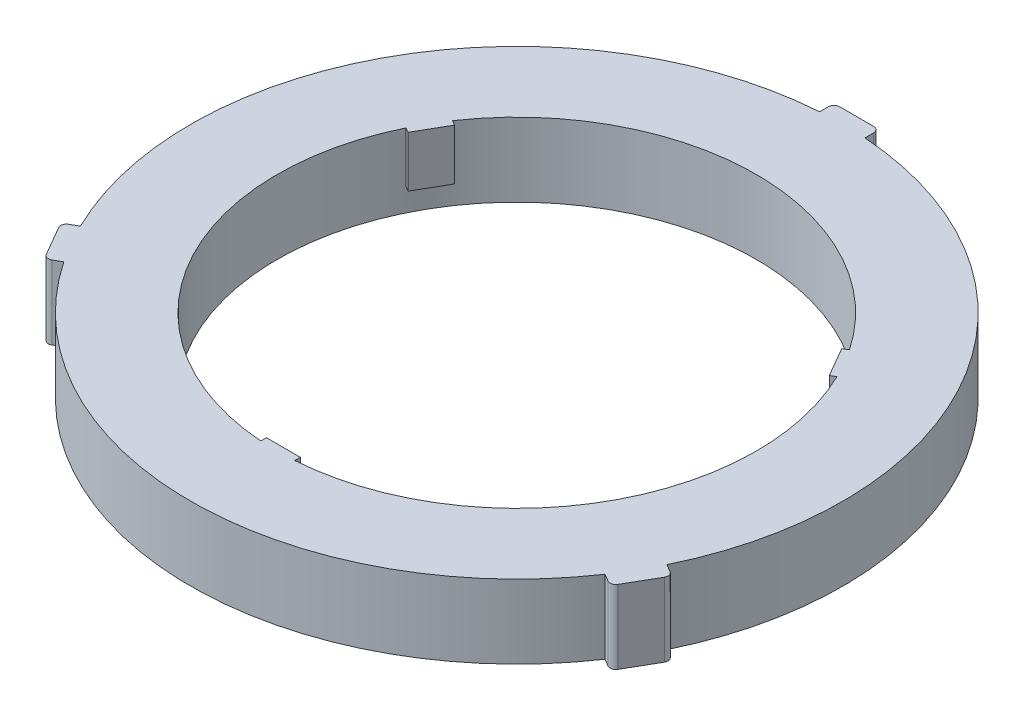
ISO-10303-21;
HEADER;
FILE_DESCRIPTION(('STEP AP214'),'2;1');
FILE_NAME('part.step','',(''),(''),'','','');
FILE_SCHEMA(('AUTOMOTIVE_DESIGN { 1 0 10303 214 1 1 1 1 }'));
ENDSEC;
DATA;
#1=APPLICATION_CONTEXT('core data for automotive mechanical design processes');
#2=APPLICATION_PROTOCOL_DEFINITION('international standard','automotive_design',2000,#1);
#3=PRODUCT_CONTEXT('',#1,'mechanical');
#4=PRODUCT('Part','Part','',(#3));
#5=PRODUCT_RELATED_PRODUCT_CATEGORY('part','',(#4));
#6=PRODUCT_DEFINITION_FORMATION('','',#4);
#7=PRODUCT_DEFINITION_CONTEXT('part definition',#1,'design');
#8=PRODUCT_DEFINITION('design','',#6,#7);
#9=PRODUCT_DEFINITION_SHAPE('','',#8);
#10=(LENGTH_UNIT() NAMED_UNIT(*) SI_UNIT(.MILLI.,.METRE.));
#11=(NAMED_UNIT(*) PLANE_ANGLE_UNIT() SI_UNIT($,.RADIAN.));
#12=(NAMED_UNIT(*) SI_UNIT($,.STERADIAN.) SOLID_ANGLE_UNIT());
#13=UNCERTAINTY_MEASURE_WITH_UNIT(LENGTH_MEASURE(1.E-05),#10,'distance_accuracy_value','');
#14=(GEOMETRIC_REPRESENTATION_CONTEXT(3) GLOBAL_UNCERTAINTY_ASSIGNED_CONTEXT((#13)) GLOBAL_UNIT_ASSIGNED_CONTEXT((#10,
#11,#12)) REPRESENTATION_CONTEXT('',''));
#15=CARTESIAN_POINT('',(0.,0.,0.));
#16=DIRECTION('',(0.,0.,1.));
#17=DIRECTION('',(1.,0.,0.));
#18=AXIS2_PLACEMENT_3D('',#15,#16,#17);
#19=CARTESIAN_POINT('',(0.,0.,0.));
#20=DIRECTION('',(0.,1.,0.));
#21=DIRECTION('',(0.,0.,1.));
#22=AXIS2_PLACEMENT_3D('',#19,#20,#21);
#23=PLANE('',#22);
#24=DIRECTION('',(0.,0.,-1.));
#25=VECTOR('',#24,1.);
#26=CARTESIAN_POINT('',(-1.99999999999999,0.,0.));
#27=LINE('',#26,#25);
#28=CARTESIAN_POINT('',(-2.,0.,-28.7304716285689));
#29=VERTEX_POINT('',#28);
#30=CARTESIAN_POINT('',(-2.,0.,-29.5));
#31=VERTEX_POINT('',#30);
#32=EDGE_CURVE('E580',#29,#31,#27,.T.);
#33=ORIENTED_EDGE('',*,*,#32,.T.);
#34=CARTESIAN_POINT('',(-1.5,0.,-29.5));
#35=DIRECTION('',(0.,1.,0.));
#36=DIRECTION('',(0.,0.,1.));
#37=AXIS2_PLACEMENT_3D('',#34,#35,#36);
#38=CIRCLE('',#37,0.5);
#39=CARTESIAN_POINT('',(-1.5,0.,-30.));
#40=VERTEX_POINT('',#39);
#41=EDGE_CURVE('E311',#31,#40,#38,.F.);
#42=ORIENTED_EDGE('',*,*,#41,.T.);
#43=DIRECTION('',(1.,0.,0.));
#44=VECTOR('',#43,1.);
#45=CARTESIAN_POINT('',(0.,0.,-30.));
#46=LINE('',#45,#44);
#47=CARTESIAN_POINT('',(1.5,0.,-30.));
#48=VERTEX_POINT('',#47);
#49=EDGE_CURVE('E577',#40,#48,#46,.T.);
#50=ORIENTED_EDGE('',*,*,#49,.T.);
#51=CARTESIAN_POINT('',(1.5,0.,-29.5));
#52=DIRECTION('',(0.,1.,0.));
#53=DIRECTION('',(0.,0.,1.));
#54=AXIS2_PLACEMENT_3D('',#51,#52,#53);
#55=CIRCLE('',#54,0.5);
#56=CARTESIAN_POINT('',(2.,0.,-29.5));
#57=VERTEX_POINT('',#56);
#58=EDGE_CURVE('E308',#48,#57,#55,.F.);
#59=ORIENTED_EDGE('',*,*,#58,.T.);
#60=DIRECTION('',(0.,0.,-1.));
#61=VECTOR('',#60,1.);
#62=CARTESIAN_POINT('',(1.99999999999999,0.,0.));
#63=LINE('',#62,#61);
#64=CARTESIAN_POINT('',(2.,0.,-28.7304716285689));
#65=VERTEX_POINT('',#64);
#66=EDGE_CURVE('E573',#65,#57,#63,.T.);
#67=ORIENTED_EDGE('',*,*,#66,.F.);
#68=CARTESIAN_POINT('',(0.,0.,0.));
#69=DIRECTION('',(0.,1.,0.));
#70=DIRECTION('',(0.,0.,1.));
#71=AXIS2_PLACEMENT_3D('',#68,#69,#70);
#72=CIRCLE('',#71,28.8);
#73=CARTESIAN_POINT('',(25.8813182930489,0.,12.6331850067151));
#74=VERTEX_POINT('',#73);
#75=EDGE_CURVE('E561',#74,#65,#72,.T.);
#76=ORIENTED_EDGE('',*,*,#75,.F.);
#77=DIRECTION('',(0.866025403784439,0.,0.5));
#78=VECTOR('',#77,1.);
#79=CARTESIAN_POINT('',(1.00000000000024,0.,-1.73205080756928));
#80=LINE('',#79,#78);
#81=CARTESIAN_POINT('',(26.5477494116414,0.,13.0179491924308));
#82=VERTEX_POINT('',#81);
#83=EDGE_CURVE('E569',#74,#82,#80,.T.);
#84=ORIENTED_EDGE('',*,*,#83,.T.);
#85=CARTESIAN_POINT('',(26.2977494116414,0.,13.450961894323));
#86=DIRECTION('',(0.,1.,0.));
#87=DIRECTION('',(0.,0.,1.));
#88=AXIS2_PLACEMENT_3D('',#85,#86,#87);
#89=CIRCLE('',#88,0.5);
#90=CARTESIAN_POINT('',(26.7307621135336,0.,13.700961894323));
#91=VERTEX_POINT('',#90);
#92=EDGE_CURVE('E305',#82,#91,#89,.F.);
#93=ORIENTED_EDGE('',*,*,#92,.T.);
#94=DIRECTION('',(-0.5,0.,0.866025403784439));
#95=VECTOR('',#94,1.);
#96=CARTESIAN_POINT('',(25.9807621135334,0.,15.0000000000001));
#97=LINE('',#96,#95);
#98=CARTESIAN_POINT('',(25.2307621135336,0.,16.2990381056764));
#99=VERTEX_POINT('',#98);
#100=EDGE_CURVE('E565',#91,#99,#97,.T.);
#101=ORIENTED_EDGE('',*,*,#100,.T.);
#102=CARTESIAN_POINT('',(24.7977494116414,0.,16.0490381056764));
#103=DIRECTION('',(0.,1.,0.));
#104=DIRECTION('',(0.,0.,1.));
#105=AXIS2_PLACEMENT_3D('',#102,#103,#104);
#106=CIRCLE('',#105,0.5);
#107=CARTESIAN_POINT('',(24.5477494116414,0.,16.4820508075686));
#108=VERTEX_POINT('',#107);
#109=EDGE_CURVE('E302',#99,#108,#106,.F.);
#110=ORIENTED_EDGE('',*,*,#109,.T.);
#111=DIRECTION('',(0.866025403784439,0.,0.5));
#112=VECTOR('',#111,1.);
#113=CARTESIAN_POINT('',(-0.999999999999765,0.,1.73205080756847));
#114=LINE('',#113,#112);
#115=CARTESIAN_POINT('',(23.881318293049,0.,16.0972866218529));
#116=VERTEX_POINT('',#115);
#117=EDGE_CURVE('E560',#116,#108,#114,.T.);
#118=ORIENTED_EDGE('',*,*,#117,.F.);
#119=CARTESIAN_POINT('',(-23.8813182930485,0.,16.0972866218537));
#120=VERTEX_POINT('',#119);
#121=EDGE_CURVE('E555',#120,#116,#72,.T.);
#122=ORIENTED_EDGE('',*,*,#121,.F.);
#123=DIRECTION('',(-0.866025403784437,0.,0.500000000000003));
#124=VECTOR('',#123,1.);
#125=CARTESIAN_POINT('',(1.00000000000018,0.,1.73205080756917));
#126=LINE('',#125,#124);
#127=CARTESIAN_POINT('',(-24.5477494116405,0.,16.4820508075691));
#128=VERTEX_POINT('',#127);
#129=EDGE_CURVE('E393',#120,#128,#126,.T.);
#130=ORIENTED_EDGE('',*,*,#129,.T.);
#131=CARTESIAN_POINT('',(-24.7977494116405,0.,16.0490381056769));
#132=DIRECTION('',(0.,1.,0.));
#133=DIRECTION('',(0.,0.,1.));
#134=AXIS2_PLACEMENT_3D('',#131,#132,#133);
#135=CIRCLE('',#134,0.5);
#136=CARTESIAN_POINT('',(-25.2307621135327,0.,16.2990381056769));
#137=VERTEX_POINT('',#136);
#138=EDGE_CURVE('E295',#128,#137,#135,.F.);
#139=ORIENTED_EDGE('',*,*,#138,.T.);
#140=DIRECTION('',(-0.500000000000001,0.,-0.866025403784438));
#141=VECTOR('',#140,1.);
#142=CARTESIAN_POINT('',(-25.9807621135329,0.,14.9999999999999));
#143=LINE('',#142,#141);
#144=CARTESIAN_POINT('',(-26.7307621135327,0.,13.7009618943236));
#145=VERTEX_POINT('',#144);
#146=EDGE_CURVE('E386',#137,#145,#143,.T.);
#147=ORIENTED_EDGE('',*,*,#146,.T.);
#148=CARTESIAN_POINT('',(-26.2977494116405,0.,13.4509618943236));
#149=DIRECTION('',(0.,1.,0.));
#150=DIRECTION('',(0.,0.,1.));
#151=AXIS2_PLACEMENT_3D('',#148,#149,#150);
#152=CIRCLE('',#151,0.5);
#153=CARTESIAN_POINT('',(-26.5477494116405,0.,13.0179491924314));
#154=VERTEX_POINT('',#153);
#155=EDGE_CURVE('E299',#145,#154,#152,.F.);
#156=ORIENTED_EDGE('',*,*,#155,.T.);
#157=DIRECTION('',(-0.86602540378444,0.,0.499999999999999));
#158=VECTOR('',#157,1.);
#159=CARTESIAN_POINT('',(-0.999999999999759,0.,-1.73205080756847));
#160=LINE('',#159,#158);
#161=CARTESIAN_POINT('',(-25.8813182930485,0.,12.6331850067159));
#162=VERTEX_POINT('',#161);
#163=EDGE_CURVE('E369',#162,#154,#160,.T.);
#164=ORIENTED_EDGE('',*,*,#163,.F.);
#165=EDGE_CURVE('E399',#29,#162,#72,.T.);
#166=ORIENTED_EDGE('',*,*,#165,.F.);
#167=EDGE_LOOP('',(#33,#42,#50,#59,#67,#76,#84,#93,#101,#110,#118,#122,#130,#139,#147,#156,#164,#166));
#168=FACE_BOUND('',#167,.T.);
#169=CARTESIAN_POINT('',(0.,0.,0.));
#170=DIRECTION('',(0.,1.,0.));
#171=DIRECTION('',(0.,0.,1.));
#172=AXIS2_PLACEMENT_3D('',#169,#170,#171);
#173=CIRCLE('',#172,21.15);
#174=CARTESIAN_POINT('',(0.,0.,21.15));
#175=VERTEX_POINT('',#174);
#176=EDGE_CURVE('E551',#175,#175,#173,.T.);
#177=ORIENTED_EDGE('',*,*,#176,.T.);
#178=EDGE_LOOP('',(#177));
#179=FACE_BOUND('',#178,.T.);
#180=ADVANCED_FACE('F47',(#168,#179),#23,.F.);
#181=CARTESIAN_POINT('',(0.,6.5,0.));
#182=DIRECTION('',(0.,-1.,0.));
#183=DIRECTION('',(0.,0.,-1.));
#184=AXIS2_PLACEMENT_3D('',#181,#182,#183);
#185=CYLINDRICAL_SURFACE('',#184,28.8);
#186=ORIENTED_EDGE('',*,*,#121,.T.);
#187=DIRECTION('',(0.,-1.,0.));
#188=VECTOR('',#187,1.);
#189=CARTESIAN_POINT('',(23.881318293049,6.5,16.0972866218529));
#190=LINE('',#189,#188);
#191=CARTESIAN_POINT('',(23.881318293049,6.5,16.0972866218529));
#192=VERTEX_POINT('',#191);
#193=EDGE_CURVE('E296',#192,#116,#190,.T.);
#194=ORIENTED_EDGE('',*,*,#193,.F.);
#195=CARTESIAN_POINT('',(0.,6.5,0.));
#196=DIRECTION('',(0.,1.,0.));
#197=DIRECTION('',(0.,0.,1.));
#198=AXIS2_PLACEMENT_3D('',#195,#196,#197);
#199=CIRCLE('',#198,28.8);
#200=CARTESIAN_POINT('',(-23.8813182930485,6.5,16.0972866218537));
#201=VERTEX_POINT('',#200);
#202=EDGE_CURVE('E518',#201,#192,#199,.T.);
#203=ORIENTED_EDGE('',*,*,#202,.F.);
#204=DIRECTION('',(0.,-1.,0.));
#205=VECTOR('',#204,1.);
#206=CARTESIAN_POINT('',(-23.8813182930485,6.5,16.0972866218537));
#207=LINE('',#206,#205);
#208=EDGE_CURVE('E290',#201,#120,#207,.T.);
#209=ORIENTED_EDGE('',*,*,#208,.T.);
#210=EDGE_LOOP('',(#186,#194,#203,#209));
#211=FACE_BOUND('',#210,.T.);
#212=ADVANCED_FACE('F638',(#211),#185,.T.);
#213=CARTESIAN_POINT('',(-0.999999999999765,6.5,1.73205080756847));
#214=DIRECTION('',(0.5,0.,-0.866025403784439));
#215=DIRECTION('',(-0.866025403784439,0.,-0.5));
#216=AXIS2_PLACEMENT_3D('',#213,#214,#215);
#217=PLANE('',#216);
#218=ORIENTED_EDGE('',*,*,#117,.T.);
#219=DIRECTION('',(0.,-1.,0.));
#220=VECTOR('',#219,1.);
#221=CARTESIAN_POINT('',(24.5477494116414,6.5,16.4820508075686));
#222=LINE('',#221,#220);
#223=CARTESIAN_POINT('',(24.5477494116414,6.5,16.4820508075686));
#224=VERTEX_POINT('',#223);
#225=EDGE_CURVE('E351',#108,#224,#222,.F.);
#226=ORIENTED_EDGE('',*,*,#225,.T.);
#227=DIRECTION('',(0.866025403784439,0.,0.5));
#228=VECTOR('',#227,1.);
#229=CARTESIAN_POINT('',(-0.999999999999765,6.5,1.73205080756847));
#230=LINE('',#229,#228);
#231=EDGE_CURVE('E522',#192,#224,#230,.T.);
#232=ORIENTED_EDGE('',*,*,#231,.F.);
#233=ORIENTED_EDGE('',*,*,#193,.T.);
#234=EDGE_LOOP('',(#218,#226,#232,#233));
#235=FACE_BOUND('',#234,.T.);
#236=ADVANCED_FACE('F634',(#235),#217,.F.);
#237=CARTESIAN_POINT('',(25.9807621135334,6.5,15.0000000000001));
#238=DIRECTION('',(0.866025403784439,0.,0.5));
#239=DIRECTION('',(0.5,0.,-0.866025403784439));
#240=AXIS2_PLACEMENT_3D('',#237,#238,#239);
#241=PLANE('',#240);
#242=ORIENTED_EDGE('',*,*,#100,.F.);
#243=DIRECTION('',(0.,-1.,0.));
#244=VECTOR('',#243,1.);
#245=CARTESIAN_POINT('',(26.7307621135336,6.5,13.700961894323));
#246=LINE('',#245,#244);
#247=CARTESIAN_POINT('',(26.7307621135336,6.5,13.700961894323));
#248=VERTEX_POINT('',#247);
#249=EDGE_CURVE('E348',#91,#248,#246,.F.);
#250=ORIENTED_EDGE('',*,*,#249,.T.);
#251=DIRECTION('',(-0.5,0.,0.866025403784439));
#252=VECTOR('',#251,1.);
#253=CARTESIAN_POINT('',(25.9807621135334,6.5,15.0000000000001));
#254=LINE('',#253,#252);
#255=CARTESIAN_POINT('',(25.2307621135336,6.5,16.2990381056764));
#256=VERTEX_POINT('',#255);
#257=EDGE_CURVE('E527',#248,#256,#254,.T.);
#258=ORIENTED_EDGE('',*,*,#257,.T.);
#259=DIRECTION('',(0.,-1.,0.));
#260=VECTOR('',#259,1.);
#261=CARTESIAN_POINT('',(25.2307621135336,0.,16.2990381056764));
#262=LINE('',#261,#260);
#263=EDGE_CURVE('E344',#256,#99,#262,.T.);
#264=ORIENTED_EDGE('',*,*,#263,.T.);
#265=EDGE_LOOP('',(#242,#250,#258,#264));
#266=FACE_BOUND('',#265,.T.);
#267=ADVANCED_FACE('F626',(#266),#241,.T.);
#268=CARTESIAN_POINT('',(1.00000000000024,6.5,-1.73205080756928));
#269=DIRECTION('',(0.5,0.,-0.866025403784439));
#270=DIRECTION('',(-0.866025403784439,0.,-0.5));
#271=AXIS2_PLACEMENT_3D('',#268,#269,#270);
#272=PLANE('',#271);
#273=DIRECTION('',(0.866025403784439,0.,0.5));
#274=VECTOR('',#273,1.);
#275=CARTESIAN_POINT('',(1.00000000000024,6.5,-1.73205080756928));
#276=LINE('',#275,#274);
#277=CARTESIAN_POINT('',(25.8813182930489,6.5,12.6331850067151));
#278=VERTEX_POINT('',#277);
#279=CARTESIAN_POINT('',(26.5477494116414,6.5,13.0179491924308));
#280=VERTEX_POINT('',#279);
#281=EDGE_CURVE('E531',#278,#280,#276,.T.);
#282=ORIENTED_EDGE('',*,*,#281,.T.);
#283=DIRECTION('',(0.,-1.,0.));
#284=VECTOR('',#283,1.);
#285=CARTESIAN_POINT('',(26.5477494116414,6.5,13.0179491924308));
#286=LINE('',#285,#284);
#287=EDGE_CURVE('E340',#280,#82,#286,.T.);
#288=ORIENTED_EDGE('',*,*,#287,.T.);
#289=ORIENTED_EDGE('',*,*,#83,.F.);
#290=DIRECTION('',(0.,-1.,0.));
#291=VECTOR('',#290,1.);
#292=CARTESIAN_POINT('',(25.8813182930489,6.5,12.6331850067151));
#293=LINE('',#292,#291);
#294=EDGE_CURVE('E415',#278,#74,#293,.T.);
#295=ORIENTED_EDGE('',*,*,#294,.F.);
#296=EDGE_LOOP('',(#282,#288,#289,#295));
#297=FACE_BOUND('',#296,.T.);
#298=ADVANCED_FACE('F620',(#297),#272,.T.);
#299=ORIENTED_EDGE('',*,*,#75,.T.);
#300=DIRECTION('',(0.,-1.,0.));
#301=VECTOR('',#300,1.);
#302=CARTESIAN_POINT('',(2.,6.5,-28.7304716285689));
#303=LINE('',#302,#301);
#304=CARTESIAN_POINT('',(2.,6.5,-28.7304716285689));
#305=VERTEX_POINT('',#304);
#306=EDGE_CURVE('E411',#305,#65,#303,.T.);
#307=ORIENTED_EDGE('',*,*,#306,.F.);
#308=EDGE_CURVE('E523',#278,#305,#199,.T.);
#309=ORIENTED_EDGE('',*,*,#308,.F.);
#310=ORIENTED_EDGE('',*,*,#294,.T.);
#311=EDGE_LOOP('',(#299,#307,#309,#310));
#312=FACE_BOUND('',#311,.T.);
#313=ADVANCED_FACE('F590',(#312),#185,.T.);
#314=CARTESIAN_POINT('',(1.99999999999999,6.5,0.));
#315=DIRECTION('',(-1.,0.,0.));
#316=DIRECTION('',(0.,0.,1.));
#317=AXIS2_PLACEMENT_3D('',#314,#315,#316);
#318=PLANE('',#317);
#319=ORIENTED_EDGE('',*,*,#66,.T.);
#320=DIRECTION('',(0.,-1.,0.));
#321=VECTOR('',#320,1.);
#322=CARTESIAN_POINT('',(2.,6.5,-29.5));
#323=LINE('',#322,#321);
#324=CARTESIAN_POINT('',(2.,6.5,-29.5));
#325=VERTEX_POINT('',#324);
#326=EDGE_CURVE('E337',#57,#325,#323,.F.);
#327=ORIENTED_EDGE('',*,*,#326,.T.);
#328=DIRECTION('',(0.,0.,-1.));
#329=VECTOR('',#328,1.);
#330=CARTESIAN_POINT('',(1.99999999999999,6.5,0.));
#331=LINE('',#330,#329);
#332=EDGE_CURVE('E535',#305,#325,#331,.T.);
#333=ORIENTED_EDGE('',*,*,#332,.F.);
#334=ORIENTED_EDGE('',*,*,#306,.T.);
#335=EDGE_LOOP('',(#319,#327,#333,#334));
#336=FACE_BOUND('',#335,.T.);
#337=ADVANCED_FACE('F596',(#336),#318,.F.);
#338=CARTESIAN_POINT('',(0.,6.5,-30.));
#339=DIRECTION('',(0.,0.,-1.));
#340=DIRECTION('',(-1.,0.,0.));
#341=AXIS2_PLACEMENT_3D('',#338,#339,#340);
#342=PLANE('',#341);
#343=ORIENTED_EDGE('',*,*,#49,.F.);
#344=DIRECTION('',(0.,-1.,0.));
#345=VECTOR('',#344,1.);
#346=CARTESIAN_POINT('',(-1.5,6.5,-30.));
#347=LINE('',#346,#345);
#348=CARTESIAN_POINT('',(-1.5,6.5,-30.));
#349=VERTEX_POINT('',#348);
#350=EDGE_CURVE('E318',#40,#349,#347,.F.);
#351=ORIENTED_EDGE('',*,*,#350,.T.);
#352=DIRECTION('',(1.,0.,0.));
#353=VECTOR('',#352,1.);
#354=CARTESIAN_POINT('',(0.,6.5,-30.));
#355=LINE('',#354,#353);
#356=CARTESIAN_POINT('',(1.5,6.5,-30.));
#357=VERTEX_POINT('',#356);
#358=EDGE_CURVE('E539',#349,#357,#355,.T.);
#359=ORIENTED_EDGE('',*,*,#358,.T.);
#360=DIRECTION('',(0.,-1.,0.));
#361=VECTOR('',#360,1.);
#362=CARTESIAN_POINT('',(1.5,0.,-30.));
#363=LINE('',#362,#361);
#364=EDGE_CURVE('E314',#357,#48,#363,.T.);
#365=ORIENTED_EDGE('',*,*,#364,.T.);
#366=EDGE_LOOP('',(#343,#351,#359,#365));
#367=FACE_BOUND('',#366,.T.);
#368=ADVANCED_FACE('F604',(#367),#342,.T.);
#369=CARTESIAN_POINT('',(-1.99999999999999,6.5,0.));
#370=DIRECTION('',(-1.,0.,0.));
#371=DIRECTION('',(0.,0.,1.));
#372=AXIS2_PLACEMENT_3D('',#369,#370,#371);
#373=PLANE('',#372);
#374=DIRECTION('',(0.,0.,-1.));
#375=VECTOR('',#374,1.);
#376=CARTESIAN_POINT('',(-1.99999999999999,6.5,0.));
#377=LINE('',#376,#375);
#378=CARTESIAN_POINT('',(-2.,6.5,-28.7304716285689));
#379=VERTEX_POINT('',#378);
#380=CARTESIAN_POINT('',(-2.,6.5,-29.5));
#381=VERTEX_POINT('',#380);
#382=EDGE_CURVE('E543',#379,#381,#377,.T.);
#383=ORIENTED_EDGE('',*,*,#382,.T.);
#384=DIRECTION('',(0.,-1.,0.));
#385=VECTOR('',#384,1.);
#386=CARTESIAN_POINT('',(-2.,6.5,-29.5));
#387=LINE('',#386,#385);
#388=EDGE_CURVE('E291',#381,#31,#387,.T.);
#389=ORIENTED_EDGE('',*,*,#388,.T.);
#390=ORIENTED_EDGE('',*,*,#32,.F.);
#391=DIRECTION('',(0.,-1.,0.));
#392=VECTOR('',#391,1.);
#393=CARTESIAN_POINT('',(-2.,6.5,-28.7304716285689));
#394=LINE('',#393,#392);
#395=EDGE_CURVE('E408',#379,#29,#394,.T.);
#396=ORIENTED_EDGE('',*,*,#395,.F.);
#397=EDGE_LOOP('',(#383,#389,#390,#396));
#398=FACE_BOUND('',#397,.T.);
#399=ADVANCED_FACE('F611',(#398),#373,.T.);
#400=ORIENTED_EDGE('',*,*,#165,.T.);
#401=DIRECTION('',(0.,-1.,0.));
#402=VECTOR('',#401,1.);
#403=CARTESIAN_POINT('',(-25.8813182930485,6.5,12.6331850067159));
#404=LINE('',#403,#402);
#405=CARTESIAN_POINT('',(-25.8813182930485,6.5,12.6331850067159));
#406=VERTEX_POINT('',#405);
#407=EDGE_CURVE('E405',#406,#162,#404,.T.);
#408=ORIENTED_EDGE('',*,*,#407,.F.);
#409=EDGE_CURVE('E375',#379,#406,#199,.T.);
#410=ORIENTED_EDGE('',*,*,#409,.F.);
#411=ORIENTED_EDGE('',*,*,#395,.T.);
#412=EDGE_LOOP('',(#400,#408,#410,#411));
#413=FACE_BOUND('',#412,.T.);
#414=ADVANCED_FACE('F612',(#413),#185,.T.);
#415=CARTESIAN_POINT('',(-0.999999999999759,6.5,-1.73205080756847));
#416=DIRECTION('',(0.499999999999999,0.,0.866025403784439));
#417=DIRECTION('',(0.86602540378444,0.,-0.499999999999999));
#418=AXIS2_PLACEMENT_3D('',#415,#416,#417);
#419=PLANE('',#418);
#420=ORIENTED_EDGE('',*,*,#163,.T.);
#421=DIRECTION('',(0.,-1.,0.));
#422=VECTOR('',#421,1.);
#423=CARTESIAN_POINT('',(-26.5477494116405,6.5,13.0179491924314));
#424=LINE('',#423,#422);
#425=CARTESIAN_POINT('',(-26.5477494116405,6.5,13.0179491924314));
#426=VERTEX_POINT('',#425);
#427=EDGE_CURVE('E56',#154,#426,#424,.F.);
#428=ORIENTED_EDGE('',*,*,#427,.T.);
#429=DIRECTION('',(-0.86602540378444,0.,0.499999999999999));
#430=VECTOR('',#429,1.);
#431=CARTESIAN_POINT('',(-0.999999999999759,6.5,-1.73205080756847));
#432=LINE('',#431,#430);
#433=EDGE_CURVE('E367',#406,#426,#432,.T.);
#434=ORIENTED_EDGE('',*,*,#433,.F.);
#435=ORIENTED_EDGE('',*,*,#407,.T.);
#436=EDGE_LOOP('',(#420,#428,#434,#435));
#437=FACE_BOUND('',#436,.T.);
#438=ADVANCED_FACE('F365',(#437),#419,.F.);
#439=CARTESIAN_POINT('',(-25.9807621135329,6.5,14.9999999999999));
#440=DIRECTION('',(-0.866025403784438,0.,0.500000000000001));
#441=DIRECTION('',(0.500000000000001,0.,0.866025403784438));
#442=AXIS2_PLACEMENT_3D('',#439,#440,#441);
#443=PLANE('',#442);
#444=DIRECTION('',(-0.500000000000001,0.,-0.866025403784438));
#445=VECTOR('',#444,1.);
#446=CARTESIAN_POINT('',(-25.9807621135329,6.5,14.9999999999999));
#447=LINE('',#446,#445);
#448=CARTESIAN_POINT('',(-25.2307621135327,6.5,16.2990381056769));
#449=VERTEX_POINT('',#448);
#450=CARTESIAN_POINT('',(-26.7307621135327,6.5,13.7009618943236));
#451=VERTEX_POINT('',#450);
#452=EDGE_CURVE('E378',#449,#451,#447,.T.);
#453=ORIENTED_EDGE('',*,*,#452,.T.);
#454=DIRECTION('',(0.,-1.,0.));
#455=VECTOR('',#454,1.);
#456=CARTESIAN_POINT('',(-26.7307621135327,0.,13.7009618943236));
#457=LINE('',#456,#455);
#458=EDGE_CURVE('E357',#451,#145,#457,.T.);
#459=ORIENTED_EDGE('',*,*,#458,.T.);
#460=ORIENTED_EDGE('',*,*,#146,.F.);
#461=DIRECTION('',(0.,-1.,0.));
#462=VECTOR('',#461,1.);
#463=CARTESIAN_POINT('',(-25.2307621135327,6.5,16.2990381056769));
#464=LINE('',#463,#462);
#465=EDGE_CURVE('E354',#137,#449,#464,.F.);
#466=ORIENTED_EDGE('',*,*,#465,.T.);
#467=EDGE_LOOP('',(#453,#459,#460,#466));
#468=FACE_BOUND('',#467,.T.);
#469=ADVANCED_FACE('F385',(#468),#443,.T.);
#470=CARTESIAN_POINT('',(1.5,6.5,0.));
#471=DIRECTION('',(-1.,0.,0.));
#472=DIRECTION('',(0.,0.,1.));
#473=AXIS2_PLACEMENT_3D('',#470,#471,#472);
#474=PLANE('',#473);
#475=DIRECTION('',(0.,-1.,0.));
#476=VECTOR('',#475,1.);
#477=CARTESIAN_POINT('',(1.5,6.5,21.096741454547));
#478=LINE('',#477,#476);
#479=CARTESIAN_POINT('',(1.5,6.5,21.096741454547));
#480=VERTEX_POINT('',#479);
#481=CARTESIAN_POINT('',(1.5,2.,21.096741454547));
#482=VERTEX_POINT('',#481);
#483=EDGE_CURVE('E287',#480,#482,#478,.T.);
#484=ORIENTED_EDGE('',*,*,#483,.T.);
#485=DIRECTION('',(0.,0.,-1.));
#486=VECTOR('',#485,1.);
#487=CARTESIAN_POINT('',(1.5,2.,0.));
#488=LINE('',#487,#486);
#489=CARTESIAN_POINT('',(1.5,2.,20.6));
#490=VERTEX_POINT('',#489);
#491=EDGE_CURVE('E252',#482,#490,#488,.T.);
#492=ORIENTED_EDGE('',*,*,#491,.T.);
#493=DIRECTION('',(0.,-1.,0.));
#494=VECTOR('',#493,1.);
#495=CARTESIAN_POINT('',(1.5,6.5,20.6));
#496=LINE('',#495,#494);
#497=CARTESIAN_POINT('',(1.5,6.5,20.6));
#498=VERTEX_POINT('',#497);
#499=EDGE_CURVE('E277',#498,#490,#496,.T.);
#500=ORIENTED_EDGE('',*,*,#499,.F.);
#501=DIRECTION('',(0.,0.,-1.));
#502=VECTOR('',#501,1.);
#503=CARTESIAN_POINT('',(1.5,6.5,0.));
#504=LINE('',#503,#502);
#505=EDGE_CURVE('E488',#480,#498,#504,.T.);
#506=ORIENTED_EDGE('',*,*,#505,.F.);
#507=EDGE_LOOP('',(#484,#492,#500,#506));
#508=FACE_BOUND('',#507,.T.);
#509=ADVANCED_FACE('F667',(#508),#474,.F.);
#510=CARTESIAN_POINT('',(0.,6.5,20.6));
#511=DIRECTION('',(0.,0.,-1.));
#512=DIRECTION('',(-1.,0.,0.));
#513=AXIS2_PLACEMENT_3D('',#510,#511,#512);
#514=PLANE('',#513);
#515=DIRECTION('',(1.,0.,0.));
#516=VECTOR('',#515,1.);
#517=CARTESIAN_POINT('',(0.,2.,20.6));
#518=LINE('',#517,#516);
#519=CARTESIAN_POINT('',(-1.5,2.,20.6));
#520=VERTEX_POINT('',#519);
#521=EDGE_CURVE('E556',#520,#490,#518,.T.);
#522=ORIENTED_EDGE('',*,*,#521,.F.);
#523=DIRECTION('',(0.,-1.,0.));
#524=VECTOR('',#523,1.);
#525=CARTESIAN_POINT('',(-1.5,6.5,20.6));
#526=LINE('',#525,#524);
#527=CARTESIAN_POINT('',(-1.5,6.5,20.6));
#528=VERTEX_POINT('',#527);
#529=EDGE_CURVE('E264',#528,#520,#526,.T.);
#530=ORIENTED_EDGE('',*,*,#529,.F.);
#531=DIRECTION('',(1.,0.,0.));
#532=VECTOR('',#531,1.);
#533=CARTESIAN_POINT('',(0.,6.5,20.6));
#534=LINE('',#533,#532);
#535=EDGE_CURVE('E492',#528,#498,#534,.T.);
#536=ORIENTED_EDGE('',*,*,#535,.T.);
#537=ORIENTED_EDGE('',*,*,#499,.T.);
#538=EDGE_LOOP('',(#522,#530,#536,#537));
#539=FACE_BOUND('',#538,.T.);
#540=ADVANCED_FACE('F707',(#539),#514,.T.);
#541=CARTESIAN_POINT('',(-1.5,6.5,0.));
#542=DIRECTION('',(-1.,0.,0.));
#543=DIRECTION('',(0.,0.,1.));
#544=AXIS2_PLACEMENT_3D('',#541,#542,#543);
#545=PLANE('',#544);
#546=DIRECTION('',(0.,0.,-1.));
#547=VECTOR('',#546,1.);
#548=CARTESIAN_POINT('',(-1.5,2.,0.));
#549=LINE('',#548,#547);
#550=CARTESIAN_POINT('',(-1.5,2.,21.096741454547));
#551=VERTEX_POINT('',#550);
#552=EDGE_CURVE('E249',#551,#520,#549,.T.);
#553=ORIENTED_EDGE('',*,*,#552,.F.);
#554=DIRECTION('',(0.,-1.,0.));
#555=VECTOR('',#554,1.);
#556=CARTESIAN_POINT('',(-1.5,6.5,21.096741454547));
#557=LINE('',#556,#555);
#558=CARTESIAN_POINT('',(-1.5,6.5,21.096741454547));
#559=VERTEX_POINT('',#558);
#560=EDGE_CURVE('E262',#559,#551,#557,.T.);
#561=ORIENTED_EDGE('',*,*,#560,.F.);
#562=DIRECTION('',(0.,0.,-1.));
#563=VECTOR('',#562,1.);
#564=CARTESIAN_POINT('',(-1.5,6.5,0.));
#565=LINE('',#564,#563);
#566=EDGE_CURVE('E496',#559,#528,#565,.T.);
#567=ORIENTED_EDGE('',*,*,#566,.T.);
#568=ORIENTED_EDGE('',*,*,#529,.T.);
#569=EDGE_LOOP('',(#553,#561,#567,#568));
#570=FACE_BOUND('',#569,.T.);
#571=ADVANCED_FACE('F260',(#570),#545,.T.);
#572=CARTESIAN_POINT('',(-0.749999999999994,6.5,1.29903810567665));
#573=DIRECTION('',(0.499999999999999,0.,-0.866025403784439));
#574=DIRECTION('',(-0.866025403784439,0.,-0.499999999999999));
#575=AXIS2_PLACEMENT_3D('',#572,#573,#574);
#576=PLANE('',#575);
#577=DIRECTION('',(0.,-1.,0.));
#578=VECTOR('',#577,1.);
#579=CARTESIAN_POINT('',(-19.0203140367099,6.5,-9.24933262159682));
#580=LINE('',#579,#578);
#581=CARTESIAN_POINT('',(-19.0203140367099,6.5,-9.24933262159682));
#582=VERTEX_POINT('',#581);
#583=CARTESIAN_POINT('',(-19.0203140367099,2.,-9.24933262159682));
#584=VERTEX_POINT('',#583);
#585=EDGE_CURVE('E273',#582,#584,#580,.T.);
#586=ORIENTED_EDGE('',*,*,#585,.T.);
#587=DIRECTION('',(0.866025403784439,0.,0.499999999999999));
#588=VECTOR('',#587,1.);
#589=CARTESIAN_POINT('',(-0.749999999999994,2.,1.29903810567665));
#590=LINE('',#589,#588);
#591=CARTESIAN_POINT('',(-18.5901233179594,2.,-9.00096189432334));
#592=VERTEX_POINT('',#591);
#593=EDGE_CURVE('E460',#584,#592,#590,.T.);
#594=ORIENTED_EDGE('',*,*,#593,.T.);
#595=DIRECTION('',(0.,-1.,0.));
#596=VECTOR('',#595,1.);
#597=CARTESIAN_POINT('',(-18.5901233179594,6.5,-9.00096189432334));
#598=LINE('',#597,#596);
#599=CARTESIAN_POINT('',(-18.5901233179594,6.5,-9.00096189432334));
#600=VERTEX_POINT('',#599);
#601=EDGE_CURVE('E280',#600,#592,#598,.T.);
#602=ORIENTED_EDGE('',*,*,#601,.F.);
#603=DIRECTION('',(0.866025403784439,0.,0.499999999999999));
#604=VECTOR('',#603,1.);
#605=CARTESIAN_POINT('',(-0.749999999999994,6.5,1.29903810567665));
#606=LINE('',#605,#604);
#607=EDGE_CURVE('E458',#582,#600,#606,.T.);
#608=ORIENTED_EDGE('',*,*,#607,.F.);
#609=EDGE_LOOP('',(#586,#594,#602,#608));
#610=FACE_BOUND('',#609,.T.);
#611=ADVANCED_FACE('F457',(#610),#576,.F.);
#612=CARTESIAN_POINT('',(-17.8401233179594,6.5,-10.3));
#613=DIRECTION('',(0.866025403784438,0.,0.5));
#614=DIRECTION('',(0.5,0.,-0.866025403784439));
#615=AXIS2_PLACEMENT_3D('',#612,#613,#614);
#616=PLANE('',#615);
#617=DIRECTION('',(-0.5,0.,0.866025403784439));
#618=VECTOR('',#617,1.);
#619=CARTESIAN_POINT('',(-17.8401233179594,2.,-10.3));
#620=LINE('',#619,#618);
#621=CARTESIAN_POINT('',(-17.0901233179594,2.,-11.5990381056766));
#622=VERTEX_POINT('',#621);
#623=EDGE_CURVE('E266',#622,#592,#620,.T.);
#624=ORIENTED_EDGE('',*,*,#623,.F.);
#625=DIRECTION('',(0.,-1.,0.));
#626=VECTOR('',#625,1.);
#627=CARTESIAN_POINT('',(-17.0901233179594,6.5,-11.5990381056766));
#628=LINE('',#627,#626);
#629=CARTESIAN_POINT('',(-17.0901233179594,6.5,-11.5990381056766));
#630=VERTEX_POINT('',#629);
#631=EDGE_CURVE('E442',#630,#622,#628,.T.);
#632=ORIENTED_EDGE('',*,*,#631,.F.);
#633=DIRECTION('',(-0.5,0.,0.866025403784439));
#634=VECTOR('',#633,1.);
#635=CARTESIAN_POINT('',(-17.8401233179594,6.5,-10.3));
#636=LINE('',#635,#634);
#637=EDGE_CURVE('E453',#630,#600,#636,.T.);
#638=ORIENTED_EDGE('',*,*,#637,.T.);
#639=ORIENTED_EDGE('',*,*,#601,.T.);
#640=EDGE_LOOP('',(#624,#632,#638,#639));
#641=FACE_BOUND('',#640,.T.);
#642=ADVANCED_FACE('F451',(#641),#616,.T.);
#643=CARTESIAN_POINT('',(0.750000000000005,6.5,-1.29903810567667));
#644=DIRECTION('',(0.499999999999999,0.,-0.866025403784439));
#645=DIRECTION('',(-0.866025403784439,0.,-0.499999999999999));
#646=AXIS2_PLACEMENT_3D('',#643,#644,#645);
#647=PLANE('',#646);
#648=DIRECTION('',(0.866025403784439,0.,0.499999999999999));
#649=VECTOR('',#648,1.);
#650=CARTESIAN_POINT('',(0.750000000000005,2.,-1.29903810567667));
#651=LINE('',#650,#649);
#652=CARTESIAN_POINT('',(-17.5203140367099,2.,-11.8474088329501));
#653=VERTEX_POINT('',#652);
#654=EDGE_CURVE('E468',#653,#622,#651,.T.);
#655=ORIENTED_EDGE('',*,*,#654,.F.);
#656=DIRECTION('',(0.,-1.,0.));
#657=VECTOR('',#656,1.);
#658=CARTESIAN_POINT('',(-17.5203140367099,6.5,-11.8474088329501));
#659=LINE('',#658,#657);
#660=CARTESIAN_POINT('',(-17.5203140367099,6.5,-11.8474088329501));
#661=VERTEX_POINT('',#660);
#662=EDGE_CURVE('E438',#661,#653,#659,.T.);
#663=ORIENTED_EDGE('',*,*,#662,.F.);
#664=DIRECTION('',(0.866025403784439,0.,0.499999999999999));
#665=VECTOR('',#664,1.);
#666=CARTESIAN_POINT('',(0.750000000000005,6.5,-1.29903810567667));
#667=LINE('',#666,#665);
#668=EDGE_CURVE('E503',#661,#630,#667,.T.);
#669=ORIENTED_EDGE('',*,*,#668,.T.);
#670=ORIENTED_EDGE('',*,*,#631,.T.);
#671=EDGE_LOOP('',(#655,#663,#669,#670));
#672=FACE_BOUND('',#671,.T.);
#673=ADVANCED_FACE('F696',(#672),#647,.T.);
#674=CARTESIAN_POINT('',(0.,6.5,0.));
#675=DIRECTION('',(0.,-1.,0.));
#676=DIRECTION('',(0.,0.,-1.));
#677=AXIS2_PLACEMENT_3D('',#674,#675,#676);
#678=CYLINDRICAL_SURFACE('',#677,21.15);
#679=ORIENTED_EDGE('',*,*,#176,.F.);
#680=EDGE_LOOP('',(#679));
#681=FACE_BOUND('',#680,.T.);
#682=CARTESIAN_POINT('',(0.,2.,0.));
#683=DIRECTION('',(0.,1.,0.));
#684=DIRECTION('',(0.,0.,1.));
#685=AXIS2_PLACEMENT_3D('',#682,#683,#684);
#686=CIRCLE('',#685,21.15);
#687=EDGE_CURVE('E246',#551,#482,#686,.T.);
#688=ORIENTED_EDGE('',*,*,#687,.T.);
#689=ORIENTED_EDGE('',*,*,#483,.F.);
#690=CARTESIAN_POINT('',(0.,6.5,0.));
#691=DIRECTION('',(0.,1.,0.));
#692=DIRECTION('',(0.,0.,1.));
#693=AXIS2_PLACEMENT_3D('',#690,#691,#692);
#694=CIRCLE('',#693,21.15);
#695=CARTESIAN_POINT('',(19.0203140367099,6.5,-9.24933262159683));
#696=VERTEX_POINT('',#695);
#697=EDGE_CURVE('E397',#480,#696,#694,.T.);
#698=ORIENTED_EDGE('',*,*,#697,.T.);
#699=DIRECTION('',(0.,-1.,0.));
#700=VECTOR('',#699,1.);
#701=CARTESIAN_POINT('',(19.0203140367099,6.5,-9.24933262159683));
#702=LINE('',#701,#700);
#703=CARTESIAN_POINT('',(19.0203140367099,2.,-9.24933262159683));
#704=VERTEX_POINT('',#703);
#705=EDGE_CURVE('E421',#696,#704,#702,.T.);
#706=ORIENTED_EDGE('',*,*,#705,.T.);
#707=CARTESIAN_POINT('',(0.,2.,0.));
#708=DIRECTION('',(0.,1.,0.));
#709=DIRECTION('',(0.,0.,1.));
#710=AXIS2_PLACEMENT_3D('',#707,#708,#709);
#711=CIRCLE('',#710,21.15);
#712=CARTESIAN_POINT('',(17.5203140367099,2.,-11.8474088329501));
#713=VERTEX_POINT('',#712);
#714=EDGE_CURVE('E475',#704,#713,#711,.T.);
#715=ORIENTED_EDGE('',*,*,#714,.T.);
#716=DIRECTION('',(0.,-1.,0.));
#717=VECTOR('',#716,1.);
#718=CARTESIAN_POINT('',(17.5203140367099,6.5,-11.8474088329501));
#719=LINE('',#718,#717);
#720=CARTESIAN_POINT('',(17.5203140367099,6.5,-11.8474088329501));
#721=VERTEX_POINT('',#720);
#722=EDGE_CURVE('E434',#721,#713,#719,.T.);
#723=ORIENTED_EDGE('',*,*,#722,.F.);
#724=EDGE_CURVE('E489',#721,#661,#694,.T.);
#725=ORIENTED_EDGE('',*,*,#724,.T.);
#726=ORIENTED_EDGE('',*,*,#662,.T.);
#727=CARTESIAN_POINT('',(0.,2.,0.));
#728=DIRECTION('',(0.,1.,0.));
#729=DIRECTION('',(0.,0.,1.));
#730=AXIS2_PLACEMENT_3D('',#727,#728,#729);
#731=CIRCLE('',#730,21.15);
#732=EDGE_CURVE('E463',#653,#584,#731,.T.);
#733=ORIENTED_EDGE('',*,*,#732,.T.);
#734=ORIENTED_EDGE('',*,*,#585,.F.);
#735=EDGE_CURVE('E271',#582,#559,#694,.T.);
#736=ORIENTED_EDGE('',*,*,#735,.T.);
#737=ORIENTED_EDGE('',*,*,#560,.T.);
#738=EDGE_LOOP('',(#688,#689,#698,#706,#715,#723,#725,#726,#733,#734,#736,#737));
#739=FACE_BOUND('',#738,.T.);
#740=ADVANCED_FACE('F269',(#681,#739),#678,.F.);
#741=CARTESIAN_POINT('',(-0.749999999999984,6.5,-1.29903810567662));
#742=DIRECTION('',(0.500000000000002,0.,0.866025403784438));
#743=DIRECTION('',(0.866025403784438,0.,-0.500000000000002));
#744=AXIS2_PLACEMENT_3D('',#741,#742,#743);
#745=PLANE('',#744);
#746=ORIENTED_EDGE('',*,*,#722,.T.);
#747=DIRECTION('',(-0.866025403784438,0.,0.500000000000002));
#748=VECTOR('',#747,1.);
#749=CARTESIAN_POINT('',(-0.749999999999984,2.,-1.29903810567662));
#750=LINE('',#749,#748);
#751=CARTESIAN_POINT('',(17.0901233179594,2.,-11.5990381056767));
#752=VERTEX_POINT('',#751);
#753=EDGE_CURVE('E478',#713,#752,#750,.T.);
#754=ORIENTED_EDGE('',*,*,#753,.T.);
#755=DIRECTION('',(0.,-1.,0.));
#756=VECTOR('',#755,1.);
#757=CARTESIAN_POINT('',(17.0901233179594,6.5,-11.5990381056767));
#758=LINE('',#757,#756);
#759=CARTESIAN_POINT('',(17.0901233179594,6.5,-11.5990381056767));
#760=VERTEX_POINT('',#759);
#761=EDGE_CURVE('E430',#760,#752,#758,.T.);
#762=ORIENTED_EDGE('',*,*,#761,.F.);
#763=DIRECTION('',(-0.866025403784438,0.,0.500000000000002));
#764=VECTOR('',#763,1.);
#765=CARTESIAN_POINT('',(-0.749999999999984,6.5,-1.29903810567662));
#766=LINE('',#765,#764);
#767=EDGE_CURVE('E507',#721,#760,#766,.T.);
#768=ORIENTED_EDGE('',*,*,#767,.F.);
#769=EDGE_LOOP('',(#746,#754,#762,#768));
#770=FACE_BOUND('',#769,.T.);
#771=ADVANCED_FACE('F689',(#770),#745,.F.);
#772=CARTESIAN_POINT('',(17.8401233179594,6.5,-10.3));
#773=DIRECTION('',(-0.866025403784438,0.,0.500000000000001));
#774=DIRECTION('',(0.500000000000001,0.,0.866025403784438));
#775=AXIS2_PLACEMENT_3D('',#772,#773,#774);
#776=PLANE('',#775);
#777=DIRECTION('',(-0.500000000000001,0.,-0.866025403784438));
#778=VECTOR('',#777,1.);
#779=CARTESIAN_POINT('',(17.8401233179594,2.,-10.3));
#780=LINE('',#779,#778);
#781=CARTESIAN_POINT('',(18.5901233179594,2.,-9.00096189432335));
#782=VERTEX_POINT('',#781);
#783=EDGE_CURVE('E482',#782,#752,#780,.T.);
#784=ORIENTED_EDGE('',*,*,#783,.F.);
#785=DIRECTION('',(0.,-1.,0.));
#786=VECTOR('',#785,1.);
#787=CARTESIAN_POINT('',(18.5901233179594,6.5,-9.00096189432335));
#788=LINE('',#787,#786);
#789=CARTESIAN_POINT('',(18.5901233179594,6.5,-9.00096189432335));
#790=VERTEX_POINT('',#789);
#791=EDGE_CURVE('E425',#790,#782,#788,.T.);
#792=ORIENTED_EDGE('',*,*,#791,.F.);
#793=DIRECTION('',(-0.500000000000001,0.,-0.866025403784438));
#794=VECTOR('',#793,1.);
#795=CARTESIAN_POINT('',(17.8401233179594,6.5,-10.3));
#796=LINE('',#795,#794);
#797=EDGE_CURVE('E510',#790,#760,#796,.T.);
#798=ORIENTED_EDGE('',*,*,#797,.T.);
#799=ORIENTED_EDGE('',*,*,#761,.T.);
#800=EDGE_LOOP('',(#784,#792,#798,#799));
#801=FACE_BOUND('',#800,.T.);
#802=ADVANCED_FACE('F685',(#801),#776,.T.);
#803=CARTESIAN_POINT('',(0.750000000000022,6.5,1.29903810567669));
#804=DIRECTION('',(0.500000000000002,0.,0.866025403784438));
#805=DIRECTION('',(0.866025403784438,0.,-0.500000000000002));
#806=AXIS2_PLACEMENT_3D('',#803,#804,#805);
#807=PLANE('',#806);
#808=DIRECTION('',(-0.866025403784438,0.,0.500000000000002));
#809=VECTOR('',#808,1.);
#810=CARTESIAN_POINT('',(0.750000000000022,2.,1.29903810567669));
#811=LINE('',#810,#809);
#812=EDGE_CURVE('E472',#704,#782,#811,.T.);
#813=ORIENTED_EDGE('',*,*,#812,.F.);
#814=ORIENTED_EDGE('',*,*,#705,.F.);
#815=DIRECTION('',(-0.866025403784438,0.,0.500000000000002));
#816=VECTOR('',#815,1.);
#817=CARTESIAN_POINT('',(0.750000000000022,6.5,1.29903810567669));
#818=LINE('',#817,#816);
#819=EDGE_CURVE('E514',#696,#790,#818,.T.);
#820=ORIENTED_EDGE('',*,*,#819,.T.);
#821=ORIENTED_EDGE('',*,*,#791,.T.);
#822=EDGE_LOOP('',(#813,#814,#820,#821));
#823=FACE_BOUND('',#822,.T.);
#824=ADVANCED_FACE('F664',(#823),#807,.T.);
#825=CARTESIAN_POINT('',(1.00000000000018,6.5,1.73205080756917));
#826=DIRECTION('',(0.500000000000003,0.,0.866025403784437));
#827=DIRECTION('',(0.866025403784437,0.,-0.500000000000003));
#828=AXIS2_PLACEMENT_3D('',#825,#826,#827);
#829=PLANE('',#828);
#830=DIRECTION('',(-0.866025403784437,0.,0.500000000000003));
#831=VECTOR('',#830,1.);
#832=CARTESIAN_POINT('',(1.00000000000018,6.5,1.73205080756917));
#833=LINE('',#832,#831);
#834=CARTESIAN_POINT('',(-24.5477494116405,6.5,16.4820508075691));
#835=VERTEX_POINT('',#834);
#836=EDGE_CURVE('E426',#201,#835,#833,.T.);
#837=ORIENTED_EDGE('',*,*,#836,.T.);
#838=DIRECTION('',(0.,-1.,0.));
#839=VECTOR('',#838,1.);
#840=CARTESIAN_POINT('',(-24.5477494116405,6.5,16.4820508075691));
#841=LINE('',#840,#839);
#842=EDGE_CURVE('E11',#835,#128,#841,.T.);
#843=ORIENTED_EDGE('',*,*,#842,.T.);
#844=ORIENTED_EDGE('',*,*,#129,.F.);
#845=ORIENTED_EDGE('',*,*,#208,.F.);
#846=EDGE_LOOP('',(#837,#843,#844,#845));
#847=FACE_BOUND('',#846,.T.);
#848=ADVANCED_FACE('F641',(#847),#829,.T.);
#849=CARTESIAN_POINT('',(0.,6.5,0.));
#850=DIRECTION('',(0.,1.,0.));
#851=DIRECTION('',(0.,0.,1.));
#852=AXIS2_PLACEMENT_3D('',#849,#850,#851);
#853=PLANE('',#852);
#854=ORIENTED_EDGE('',*,*,#697,.F.);
#855=ORIENTED_EDGE('',*,*,#505,.T.);
#856=ORIENTED_EDGE('',*,*,#535,.F.);
#857=ORIENTED_EDGE('',*,*,#566,.F.);
#858=ORIENTED_EDGE('',*,*,#735,.F.);
#859=ORIENTED_EDGE('',*,*,#607,.T.);
#860=ORIENTED_EDGE('',*,*,#637,.F.);
#861=ORIENTED_EDGE('',*,*,#668,.F.);
#862=ORIENTED_EDGE('',*,*,#724,.F.);
#863=ORIENTED_EDGE('',*,*,#767,.T.);
#864=ORIENTED_EDGE('',*,*,#797,.F.);
#865=ORIENTED_EDGE('',*,*,#819,.F.);
#866=EDGE_LOOP('',(#854,#855,#856,#857,#858,#859,#860,#861,#862,#863,#864,#865));
#867=FACE_BOUND('',#866,.T.);
#868=ORIENTED_EDGE('',*,*,#358,.F.);
#869=CARTESIAN_POINT('',(-1.5,6.5,-29.5));
#870=DIRECTION('',(0.,1.,0.));
#871=DIRECTION('',(0.,0.,1.));
#872=AXIS2_PLACEMENT_3D('',#869,#870,#871);
#873=CIRCLE('',#872,0.5);
#874=EDGE_CURVE('E334',#349,#381,#873,.T.);
#875=ORIENTED_EDGE('',*,*,#874,.T.);
#876=ORIENTED_EDGE('',*,*,#382,.F.);
#877=ORIENTED_EDGE('',*,*,#409,.T.);
#878=ORIENTED_EDGE('',*,*,#433,.T.);
#879=CARTESIAN_POINT('',(-26.2977494116405,6.5,13.4509618943236));
#880=DIRECTION('',(0.,1.,0.));
#881=DIRECTION('',(0.,0.,1.));
#882=AXIS2_PLACEMENT_3D('',#879,#880,#881);
#883=CIRCLE('',#882,0.5);
#884=EDGE_CURVE('E69',#426,#451,#883,.T.);
#885=ORIENTED_EDGE('',*,*,#884,.T.);
#886=ORIENTED_EDGE('',*,*,#452,.F.);
#887=CARTESIAN_POINT('',(-24.7977494116405,6.5,16.0490381056769));
#888=DIRECTION('',(0.,1.,0.));
#889=DIRECTION('',(0.,0.,1.));
#890=AXIS2_PLACEMENT_3D('',#887,#888,#889);
#891=CIRCLE('',#890,0.5);
#892=EDGE_CURVE('E63',#449,#835,#891,.T.);
#893=ORIENTED_EDGE('',*,*,#892,.T.);
#894=ORIENTED_EDGE('',*,*,#836,.F.);
#895=ORIENTED_EDGE('',*,*,#202,.T.);
#896=ORIENTED_EDGE('',*,*,#231,.T.);
#897=CARTESIAN_POINT('',(24.7977494116414,6.5,16.0490381056764));
#898=DIRECTION('',(0.,1.,0.));
#899=DIRECTION('',(0.,0.,1.));
#900=AXIS2_PLACEMENT_3D('',#897,#898,#899);
#901=CIRCLE('',#900,0.5);
#902=EDGE_CURVE('E325',#224,#256,#901,.T.);
#903=ORIENTED_EDGE('',*,*,#902,.T.);
#904=ORIENTED_EDGE('',*,*,#257,.F.);
#905=CARTESIAN_POINT('',(26.2977494116414,6.5,13.450961894323));
#906=DIRECTION('',(0.,1.,0.));
#907=DIRECTION('',(0.,0.,1.));
#908=AXIS2_PLACEMENT_3D('',#905,#906,#907);
#909=CIRCLE('',#908,0.5);
#910=EDGE_CURVE('E328',#248,#280,#909,.T.);
#911=ORIENTED_EDGE('',*,*,#910,.T.);
#912=ORIENTED_EDGE('',*,*,#281,.F.);
#913=ORIENTED_EDGE('',*,*,#308,.T.);
#914=ORIENTED_EDGE('',*,*,#332,.T.);
#915=CARTESIAN_POINT('',(1.5,6.5,-29.5));
#916=DIRECTION('',(0.,1.,0.));
#917=DIRECTION('',(0.,0.,1.));
#918=AXIS2_PLACEMENT_3D('',#915,#916,#917);
#919=CIRCLE('',#918,0.5);
#920=EDGE_CURVE('E331',#325,#357,#919,.T.);
#921=ORIENTED_EDGE('',*,*,#920,.T.);
#922=EDGE_LOOP('',(#868,#875,#876,#877,#878,#885,#886,#893,#894,#895,#896,#903,#904,#911,#912,
#913,#914,#921));
#923=FACE_BOUND('',#922,.T.);
#924=ADVANCED_FACE('F372',(#867,#923),#853,.T.);
#925=CARTESIAN_POINT('',(-1.5,6.5,-29.5));
#926=DIRECTION('',(0.,-1.,0.));
#927=DIRECTION('',(0.,0.,-1.));
#928=AXIS2_PLACEMENT_3D('',#925,#926,#927);
#929=CYLINDRICAL_SURFACE('',#928,0.5);
#930=ORIENTED_EDGE('',*,*,#874,.F.);
#931=ORIENTED_EDGE('',*,*,#350,.F.);
#932=ORIENTED_EDGE('',*,*,#41,.F.);
#933=ORIENTED_EDGE('',*,*,#388,.F.);
#934=EDGE_LOOP('',(#930,#931,#932,#933));
#935=FACE_BOUND('',#934,.T.);
#936=ADVANCED_FACE('F609',(#935),#929,.T.);
#937=CARTESIAN_POINT('',(1.5,6.5,-29.5));
#938=DIRECTION('',(0.,1.,0.));
#939=DIRECTION('',(0.,0.,1.));
#940=AXIS2_PLACEMENT_3D('',#937,#938,#939);
#941=CYLINDRICAL_SURFACE('',#940,0.5);
#942=ORIENTED_EDGE('',*,*,#920,.F.);
#943=ORIENTED_EDGE('',*,*,#326,.F.);
#944=ORIENTED_EDGE('',*,*,#58,.F.);
#945=ORIENTED_EDGE('',*,*,#364,.F.);
#946=EDGE_LOOP('',(#942,#943,#944,#945));
#947=FACE_BOUND('',#946,.T.);
#948=ADVANCED_FACE('F602',(#947),#941,.T.);
#949=CARTESIAN_POINT('',(26.2977494116414,6.5,13.450961894323));
#950=DIRECTION('',(0.,-1.,0.));
#951=DIRECTION('',(0.,0.,-1.));
#952=AXIS2_PLACEMENT_3D('',#949,#950,#951);
#953=CYLINDRICAL_SURFACE('',#952,0.5);
#954=ORIENTED_EDGE('',*,*,#910,.F.);
#955=ORIENTED_EDGE('',*,*,#249,.F.);
#956=ORIENTED_EDGE('',*,*,#92,.F.);
#957=ORIENTED_EDGE('',*,*,#287,.F.);
#958=EDGE_LOOP('',(#954,#955,#956,#957));
#959=FACE_BOUND('',#958,.T.);
#960=ADVANCED_FACE('F622',(#959),#953,.T.);
#961=CARTESIAN_POINT('',(24.7977494116414,6.5,16.0490381056764));
#962=DIRECTION('',(0.,1.,0.));
#963=DIRECTION('',(0.,0.,1.));
#964=AXIS2_PLACEMENT_3D('',#961,#962,#963);
#965=CYLINDRICAL_SURFACE('',#964,0.5);
#966=ORIENTED_EDGE('',*,*,#902,.F.);
#967=ORIENTED_EDGE('',*,*,#225,.F.);
#968=ORIENTED_EDGE('',*,*,#109,.F.);
#969=ORIENTED_EDGE('',*,*,#263,.F.);
#970=EDGE_LOOP('',(#966,#967,#968,#969));
#971=FACE_BOUND('',#970,.T.);
#972=ADVANCED_FACE('F630',(#971),#965,.T.);
#973=CARTESIAN_POINT('',(-26.2977494116405,6.5,13.4509618943236));
#974=DIRECTION('',(0.,1.,0.));
#975=DIRECTION('',(0.,0.,1.));
#976=AXIS2_PLACEMENT_3D('',#973,#974,#975);
#977=CYLINDRICAL_SURFACE('',#976,0.5);
#978=ORIENTED_EDGE('',*,*,#884,.F.);
#979=ORIENTED_EDGE('',*,*,#427,.F.);
#980=ORIENTED_EDGE('',*,*,#155,.F.);
#981=ORIENTED_EDGE('',*,*,#458,.F.);
#982=EDGE_LOOP('',(#978,#979,#980,#981));
#983=FACE_BOUND('',#982,.T.);
#984=ADVANCED_FACE('F381',(#983),#977,.T.);
#985=CARTESIAN_POINT('',(-24.7977494116405,6.5,16.0490381056769));
#986=DIRECTION('',(0.,-1.,0.));
#987=DIRECTION('',(0.,0.,-1.));
#988=AXIS2_PLACEMENT_3D('',#985,#986,#987);
#989=CYLINDRICAL_SURFACE('',#988,0.5);
#990=ORIENTED_EDGE('',*,*,#892,.F.);
#991=ORIENTED_EDGE('',*,*,#465,.F.);
#992=ORIENTED_EDGE('',*,*,#138,.F.);
#993=ORIENTED_EDGE('',*,*,#842,.F.);
#994=EDGE_LOOP('',(#990,#991,#992,#993));
#995=FACE_BOUND('',#994,.T.);
#996=ADVANCED_FACE('F49',(#995),#989,.T.);
#997=CARTESIAN_POINT('',(0.,2.,0.));
#998=DIRECTION('',(0.,1.,0.));
#999=DIRECTION('',(0.,0.,1.));
#1000=AXIS2_PLACEMENT_3D('',#997,#998,#999);
#1001=PLANE('',#1000);
#1002=ORIENTED_EDGE('',*,*,#812,.T.);
#1003=ORIENTED_EDGE('',*,*,#783,.T.);
#1004=ORIENTED_EDGE('',*,*,#753,.F.);
#1005=ORIENTED_EDGE('',*,*,#714,.F.);
#1006=EDGE_LOOP('',(#1002,#1003,#1004,#1005));
#1007=FACE_BOUND('',#1006,.T.);
#1008=ADVANCED_FACE('F645',(#1007),#1001,.F.);
#1009=CARTESIAN_POINT('',(0.,2.,0.));
#1010=DIRECTION('',(0.,1.,0.));
#1011=DIRECTION('',(0.,0.,1.));
#1012=AXIS2_PLACEMENT_3D('',#1009,#1010,#1011);
#1013=PLANE('',#1012);
#1014=ORIENTED_EDGE('',*,*,#654,.T.);
#1015=ORIENTED_EDGE('',*,*,#623,.T.);
#1016=ORIENTED_EDGE('',*,*,#593,.F.);
#1017=ORIENTED_EDGE('',*,*,#732,.F.);
#1018=EDGE_LOOP('',(#1014,#1015,#1016,#1017));
#1019=FACE_BOUND('',#1018,.T.);
#1020=ADVANCED_FACE('F651',(#1019),#1013,.F.);
#1021=CARTESIAN_POINT('',(0.,2.,0.));
#1022=DIRECTION('',(0.,1.,0.));
#1023=DIRECTION('',(0.,0.,1.));
#1024=AXIS2_PLACEMENT_3D('',#1021,#1022,#1023);
#1025=PLANE('',#1024);
#1026=ORIENTED_EDGE('',*,*,#552,.T.);
#1027=ORIENTED_EDGE('',*,*,#521,.T.);
#1028=ORIENTED_EDGE('',*,*,#491,.F.);
#1029=ORIENTED_EDGE('',*,*,#687,.F.);
#1030=EDGE_LOOP('',(#1026,#1027,#1028,#1029));
#1031=FACE_BOUND('',#1030,.T.);
#1032=ADVANCED_FACE('F248',(#1031),#1025,.F.);
#1033=CLOSED_SHELL('',(#180,#212,#236,#267,#298,#313,#337,#368,#399,#414,#438,#469,#509,#540,
#571,#611,#642,#673,#740,#771,#802,#824,#848,#924,#936,#948,#960,#972,#984,#996,#1008,#1020,#1032));
#1034=MANIFOLD_SOLID_BREP('B2',#1033);
#1035=ADVANCED_BREP_SHAPE_REPRESENTATION('',(#18,#1034),#14);
#1036=SHAPE_DEFINITION_REPRESENTATION(#9,#1035);
ENDSEC;
END-ISO-10303-21;
